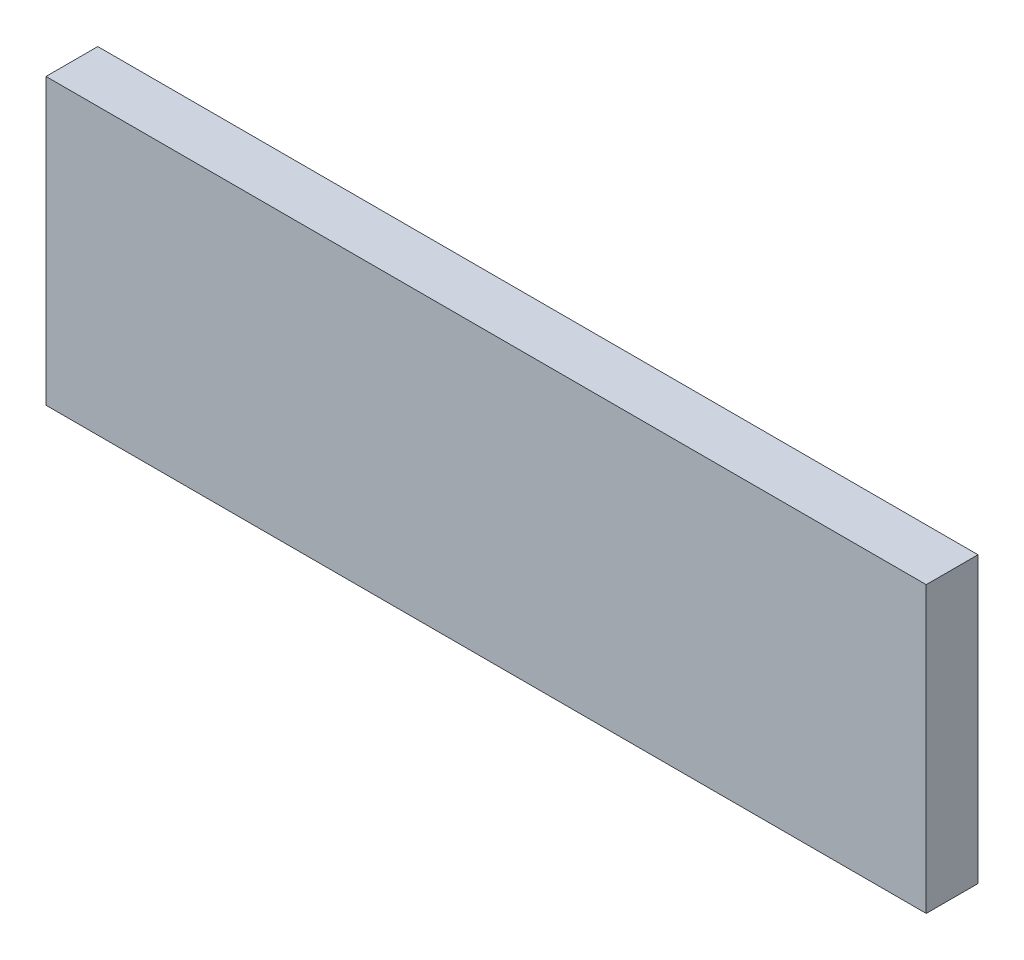
ISO-10303-21;
HEADER;
FILE_DESCRIPTION(('STEP AP214'),'2;1');
FILE_NAME('part.step','',(''),(''),'','','');
FILE_SCHEMA(('AUTOMOTIVE_DESIGN { 1 0 10303 214 1 1 1 1 }'));
ENDSEC;
DATA;
#1=APPLICATION_CONTEXT('core data for automotive mechanical design processes');
#2=APPLICATION_PROTOCOL_DEFINITION('international standard','automotive_design',2000,#1);
#3=PRODUCT_CONTEXT('',#1,'mechanical');
#4=PRODUCT('Part','Part','',(#3));
#5=PRODUCT_RELATED_PRODUCT_CATEGORY('part','',(#4));
#6=PRODUCT_DEFINITION_FORMATION('','',#4);
#7=PRODUCT_DEFINITION_CONTEXT('part definition',#1,'design');
#8=PRODUCT_DEFINITION('design','',#6,#7);
#9=PRODUCT_DEFINITION_SHAPE('','',#8);
#10=(LENGTH_UNIT() NAMED_UNIT(*) SI_UNIT(.MILLI.,.METRE.));
#11=(NAMED_UNIT(*) PLANE_ANGLE_UNIT() SI_UNIT($,.RADIAN.));
#12=(NAMED_UNIT(*) SI_UNIT($,.STERADIAN.) SOLID_ANGLE_UNIT());
#13=UNCERTAINTY_MEASURE_WITH_UNIT(LENGTH_MEASURE(1.E-05),#10,'distance_accuracy_value','');
#14=(GEOMETRIC_REPRESENTATION_CONTEXT(3) GLOBAL_UNCERTAINTY_ASSIGNED_CONTEXT((#13)) GLOBAL_UNIT_ASSIGNED_CONTEXT((#10,
#11,#12)) REPRESENTATION_CONTEXT('',''));
#15=CARTESIAN_POINT('',(0.,0.,0.));
#16=DIRECTION('',(0.,0.,1.));
#17=DIRECTION('',(1.,0.,0.));
#18=AXIS2_PLACEMENT_3D('',#15,#16,#17);
#19=CARTESIAN_POINT('',(-85.,-27.5,10.));
#20=DIRECTION('',(1.,0.,0.));
#21=DIRECTION('',(0.,0.,-1.));
#22=AXIS2_PLACEMENT_3D('',#19,#20,#21);
#23=PLANE('',#22);
#24=DIRECTION('',(0.,-1.,0.));
#25=VECTOR('',#24,1.);
#26=CARTESIAN_POINT('',(-85.,-27.5,0.));
#27=LINE('',#26,#25);
#28=CARTESIAN_POINT('',(-85.,27.5,0.));
#29=VERTEX_POINT('',#28);
#30=CARTESIAN_POINT('',(-85.,-27.5,0.));
#31=VERTEX_POINT('',#30);
#32=EDGE_CURVE('E102',#29,#31,#27,.T.);
#33=ORIENTED_EDGE('',*,*,#32,.T.);
#34=DIRECTION('',(0.,0.,-1.));
#35=VECTOR('',#34,1.);
#36=CARTESIAN_POINT('',(-85.,-27.5,10.));
#37=LINE('',#36,#35);
#38=CARTESIAN_POINT('',(-85.,-27.5,10.));
#39=VERTEX_POINT('',#38);
#40=EDGE_CURVE('E11',#39,#31,#37,.T.);
#41=ORIENTED_EDGE('',*,*,#40,.F.);
#42=DIRECTION('',(0.,-1.,0.));
#43=VECTOR('',#42,1.);
#44=CARTESIAN_POINT('',(-85.,-27.5,10.));
#45=LINE('',#44,#43);
#46=CARTESIAN_POINT('',(-85.,27.5,10.));
#47=VERTEX_POINT('',#46);
#48=EDGE_CURVE('E90',#47,#39,#45,.T.);
#49=ORIENTED_EDGE('',*,*,#48,.F.);
#50=DIRECTION('',(0.,0.,-1.));
#51=VECTOR('',#50,1.);
#52=CARTESIAN_POINT('',(-85.,27.5,10.));
#53=LINE('',#52,#51);
#54=EDGE_CURVE('E98',#47,#29,#53,.T.);
#55=ORIENTED_EDGE('',*,*,#54,.T.);
#56=EDGE_LOOP('',(#33,#41,#49,#55));
#57=FACE_BOUND('',#56,.T.);
#58=ADVANCED_FACE('F39',(#57),#23,.F.);
#59=CARTESIAN_POINT('',(-85.,-27.5,10.));
#60=DIRECTION('',(0.,1.,0.));
#61=DIRECTION('',(0.,0.,1.));
#62=AXIS2_PLACEMENT_3D('',#59,#60,#61);
#63=PLANE('',#62);
#64=DIRECTION('',(1.,0.,0.));
#65=VECTOR('',#64,1.);
#66=CARTESIAN_POINT('',(-85.,-27.5,0.));
#67=LINE('',#66,#65);
#68=CARTESIAN_POINT('',(85.,-27.5,0.));
#69=VERTEX_POINT('',#68);
#70=EDGE_CURVE('E94',#31,#69,#67,.T.);
#71=ORIENTED_EDGE('',*,*,#70,.T.);
#72=DIRECTION('',(0.,0.,-1.));
#73=VECTOR('',#72,1.);
#74=CARTESIAN_POINT('',(85.,-27.5,10.));
#75=LINE('',#74,#73);
#76=CARTESIAN_POINT('',(85.,-27.5,10.));
#77=VERTEX_POINT('',#76);
#78=EDGE_CURVE('E47',#77,#69,#75,.T.);
#79=ORIENTED_EDGE('',*,*,#78,.F.);
#80=DIRECTION('',(1.,0.,0.));
#81=VECTOR('',#80,1.);
#82=CARTESIAN_POINT('',(-85.,-27.5,10.));
#83=LINE('',#82,#81);
#84=EDGE_CURVE('E85',#39,#77,#83,.T.);
#85=ORIENTED_EDGE('',*,*,#84,.F.);
#86=ORIENTED_EDGE('',*,*,#40,.T.);
#87=EDGE_LOOP('',(#71,#79,#85,#86));
#88=FACE_BOUND('',#87,.T.);
#89=ADVANCED_FACE('F93',(#88),#63,.F.);
#90=CARTESIAN_POINT('',(85.,-27.5,10.));
#91=DIRECTION('',(-1.,0.,0.));
#92=DIRECTION('',(0.,0.,1.));
#93=AXIS2_PLACEMENT_3D('',#90,#91,#92);
#94=PLANE('',#93);
#95=DIRECTION('',(0.,1.,0.));
#96=VECTOR('',#95,1.);
#97=CARTESIAN_POINT('',(85.,-27.5,0.));
#98=LINE('',#97,#96);
#99=CARTESIAN_POINT('',(85.,27.5,0.));
#100=VERTEX_POINT('',#99);
#101=EDGE_CURVE('E72',#69,#100,#98,.T.);
#102=ORIENTED_EDGE('',*,*,#101,.T.);
#103=DIRECTION('',(0.,0.,-1.));
#104=VECTOR('',#103,1.);
#105=CARTESIAN_POINT('',(85.,27.5,10.));
#106=LINE('',#105,#104);
#107=CARTESIAN_POINT('',(85.,27.5,10.));
#108=VERTEX_POINT('',#107);
#109=EDGE_CURVE('E95',#108,#100,#106,.T.);
#110=ORIENTED_EDGE('',*,*,#109,.F.);
#111=DIRECTION('',(0.,1.,0.));
#112=VECTOR('',#111,1.);
#113=CARTESIAN_POINT('',(85.,-27.5,10.));
#114=LINE('',#113,#112);
#115=EDGE_CURVE('E88',#77,#108,#114,.T.);
#116=ORIENTED_EDGE('',*,*,#115,.F.);
#117=ORIENTED_EDGE('',*,*,#78,.T.);
#118=EDGE_LOOP('',(#102,#110,#116,#117));
#119=FACE_BOUND('',#118,.T.);
#120=ADVANCED_FACE('F96',(#119),#94,.F.);
#121=CARTESIAN_POINT('',(-85.,27.5,10.));
#122=DIRECTION('',(0.,-1.,0.));
#123=DIRECTION('',(0.,0.,-1.));
#124=AXIS2_PLACEMENT_3D('',#121,#122,#123);
#125=PLANE('',#124);
#126=DIRECTION('',(-1.,0.,0.));
#127=VECTOR('',#126,1.);
#128=CARTESIAN_POINT('',(-85.,27.5,0.));
#129=LINE('',#128,#127);
#130=EDGE_CURVE('E78',#100,#29,#129,.T.);
#131=ORIENTED_EDGE('',*,*,#130,.T.);
#132=ORIENTED_EDGE('',*,*,#54,.F.);
#133=DIRECTION('',(-1.,0.,0.));
#134=VECTOR('',#133,1.);
#135=CARTESIAN_POINT('',(-85.,27.5,10.));
#136=LINE('',#135,#134);
#137=EDGE_CURVE('E55',#108,#47,#136,.T.);
#138=ORIENTED_EDGE('',*,*,#137,.F.);
#139=ORIENTED_EDGE('',*,*,#109,.T.);
#140=EDGE_LOOP('',(#131,#132,#138,#139));
#141=FACE_BOUND('',#140,.T.);
#142=ADVANCED_FACE('F109',(#141),#125,.F.);
#143=CARTESIAN_POINT('',(0.,0.,10.));
#144=DIRECTION('',(0.,0.,-1.));
#145=DIRECTION('',(-1.,0.,0.));
#146=AXIS2_PLACEMENT_3D('',#143,#144,#145);
#147=PLANE('',#146);
#148=ORIENTED_EDGE('',*,*,#48,.T.);
#149=ORIENTED_EDGE('',*,*,#84,.T.);
#150=ORIENTED_EDGE('',*,*,#115,.T.);
#151=ORIENTED_EDGE('',*,*,#137,.T.);
#152=EDGE_LOOP('',(#148,#149,#150,#151));
#153=FACE_BOUND('',#152,.T.);
#154=ADVANCED_FACE('F86',(#153),#147,.F.);
#155=CARTESIAN_POINT('',(0.,0.,0.));
#156=DIRECTION('',(0.,0.,-1.));
#157=DIRECTION('',(-1.,0.,0.));
#158=AXIS2_PLACEMENT_3D('',#155,#156,#157);
#159=PLANE('',#158);
#160=ORIENTED_EDGE('',*,*,#32,.F.);
#161=ORIENTED_EDGE('',*,*,#130,.F.);
#162=ORIENTED_EDGE('',*,*,#101,.F.);
#163=ORIENTED_EDGE('',*,*,#70,.F.);
#164=EDGE_LOOP('',(#160,#161,#162,#163));
#165=FACE_BOUND('',#164,.T.);
#166=ADVANCED_FACE('F112',(#165),#159,.T.);
#167=CLOSED_SHELL('',(#58,#89,#120,#142,#154,#166));
#168=MANIFOLD_SOLID_BREP('B2',#167);
#169=ADVANCED_BREP_SHAPE_REPRESENTATION('',(#18,#168),#14);
#170=SHAPE_DEFINITION_REPRESENTATION(#9,#169);
ENDSEC;
END-ISO-10303-21;
